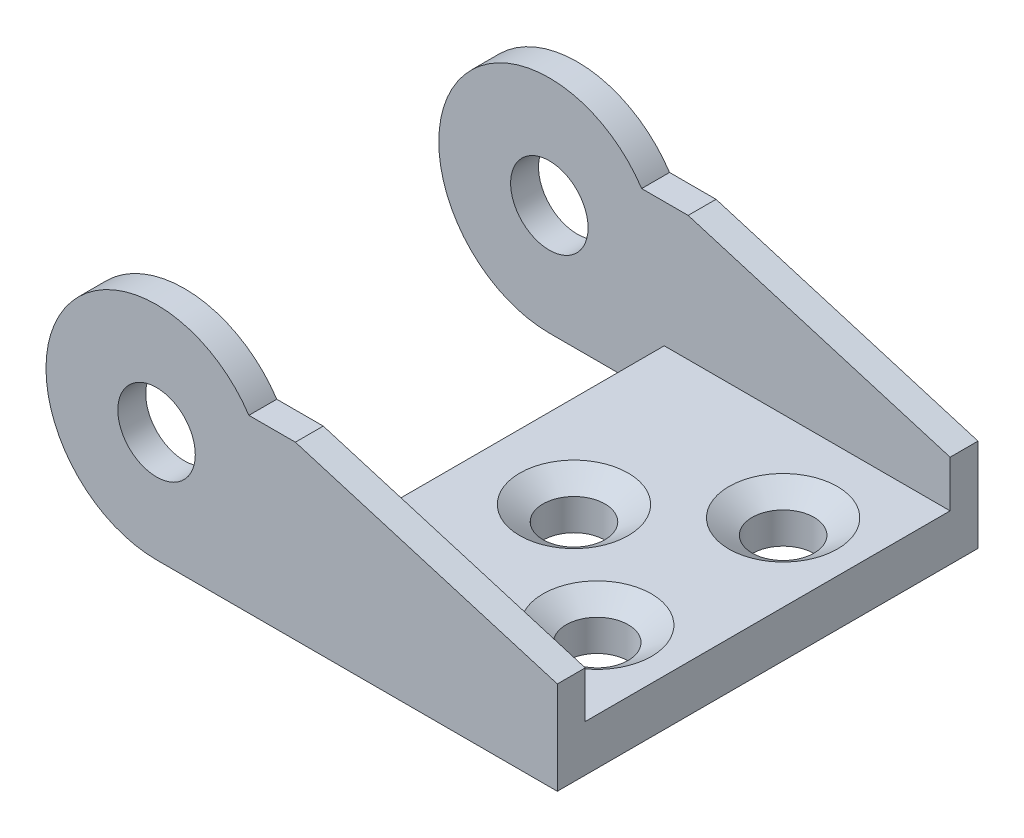
ISO-10303-21;
HEADER;
FILE_DESCRIPTION(('STEP AP214'),'2;1');
FILE_NAME('part.step','',(''),(''),'','','');
FILE_SCHEMA(('AUTOMOTIVE_DESIGN { 1 0 10303 214 1 1 1 1 }'));
ENDSEC;
DATA;
#1=APPLICATION_CONTEXT('core data for automotive mechanical design processes');
#2=APPLICATION_PROTOCOL_DEFINITION('international standard','automotive_design',2000,#1);
#3=PRODUCT_CONTEXT('',#1,'mechanical');
#4=PRODUCT('Part','Part','',(#3));
#5=PRODUCT_RELATED_PRODUCT_CATEGORY('part','',(#4));
#6=PRODUCT_DEFINITION_FORMATION('','',#4);
#7=PRODUCT_DEFINITION_CONTEXT('part definition',#1,'design');
#8=PRODUCT_DEFINITION('design','',#6,#7);
#9=PRODUCT_DEFINITION_SHAPE('','',#8);
#10=(LENGTH_UNIT() NAMED_UNIT(*) SI_UNIT(.MILLI.,.METRE.));
#11=(NAMED_UNIT(*) PLANE_ANGLE_UNIT() SI_UNIT($,.RADIAN.));
#12=(NAMED_UNIT(*) SI_UNIT($,.STERADIAN.) SOLID_ANGLE_UNIT());
#13=UNCERTAINTY_MEASURE_WITH_UNIT(LENGTH_MEASURE(1.E-05),#10,'distance_accuracy_value','');
#14=(GEOMETRIC_REPRESENTATION_CONTEXT(3) GLOBAL_UNCERTAINTY_ASSIGNED_CONTEXT((#13)) GLOBAL_UNIT_ASSIGNED_CONTEXT((#10,
#11,#12)) REPRESENTATION_CONTEXT('',''));
#15=CARTESIAN_POINT('',(0.,0.,0.));
#16=DIRECTION('',(0.,0.,1.));
#17=DIRECTION('',(1.,0.,0.));
#18=AXIS2_PLACEMENT_3D('',#15,#16,#17);
#19=CARTESIAN_POINT('',(7.135,7.135,-27.15));
#20=DIRECTION('',(0.,0.,1.));
#21=DIRECTION('',(1.,0.,0.));
#22=AXIS2_PLACEMENT_3D('',#19,#20,#21);
#23=CYLINDRICAL_SURFACE('',#22,7.135);
#24=DIRECTION('',(0.,0.,1.));
#25=VECTOR('',#24,1.);
#26=CARTESIAN_POINT('',(7.135,0.,-27.15));
#27=LINE('',#26,#25);
#28=CARTESIAN_POINT('',(7.135,0.,-27.15));
#29=VERTEX_POINT('',#28);
#30=CARTESIAN_POINT('',(7.135,0.,-25.35));
#31=VERTEX_POINT('',#30);
#32=EDGE_CURVE('E167',#29,#31,#27,.T.);
#33=ORIENTED_EDGE('',*,*,#32,.T.);
#34=CARTESIAN_POINT('',(7.135,7.135,-25.35));
#35=DIRECTION('',(0.,0.,-1.));
#36=DIRECTION('',(0.,1.,0.));
#37=AXIS2_PLACEMENT_3D('',#34,#35,#36);
#38=CIRCLE('',#37,7.135);
#39=CARTESIAN_POINT('',(13.0934058270648,11.06,-25.35));
#40=VERTEX_POINT('',#39);
#41=EDGE_CURVE('E202',#31,#40,#38,.T.);
#42=ORIENTED_EDGE('',*,*,#41,.T.);
#43=DIRECTION('',(0.,0.,1.));
#44=VECTOR('',#43,1.);
#45=CARTESIAN_POINT('',(13.0934058270648,11.06,-27.15));
#46=LINE('',#45,#44);
#47=CARTESIAN_POINT('',(13.0934058270648,11.06,-27.15));
#48=VERTEX_POINT('',#47);
#49=EDGE_CURVE('E178',#48,#40,#46,.T.);
#50=ORIENTED_EDGE('',*,*,#49,.F.);
#51=CARTESIAN_POINT('',(7.135,7.135,-27.15));
#52=DIRECTION('',(0.,0.,1.));
#53=DIRECTION('',(1.,0.,0.));
#54=AXIS2_PLACEMENT_3D('',#51,#52,#53);
#55=CIRCLE('',#54,7.135);
#56=EDGE_CURVE('E184',#48,#29,#55,.T.);
#57=ORIENTED_EDGE('',*,*,#56,.T.);
#58=EDGE_LOOP('',(#33,#42,#50,#57));
#59=FACE_BOUND('',#58,.T.);
#60=ADVANCED_FACE('F41',(#59),#23,.T.);
#61=CARTESIAN_POINT('',(33.,14.27,0.));
#62=DIRECTION('',(0.,0.,-1.));
#63=DIRECTION('',(0.,1.,0.));
#64=AXIS2_PLACEMENT_3D('',#61,#62,#63);
#65=PLANE('',#64);
#66=CARTESIAN_POINT('',(7.135,7.135,0.));
#67=DIRECTION('',(0.,0.,1.));
#68=DIRECTION('',(1.,0.,0.));
#69=AXIS2_PLACEMENT_3D('',#66,#67,#68);
#70=CIRCLE('',#69,2.5);
#71=CARTESIAN_POINT('',(9.635,7.135,0.));
#72=VERTEX_POINT('',#71);
#73=EDGE_CURVE('E189',#72,#72,#70,.T.);
#74=ORIENTED_EDGE('',*,*,#73,.F.);
#75=EDGE_LOOP('',(#74));
#76=FACE_BOUND('',#75,.T.);
#77=CARTESIAN_POINT('',(7.135,7.135,0.));
#78=DIRECTION('',(0.,0.,1.));
#79=DIRECTION('',(1.,0.,0.));
#80=AXIS2_PLACEMENT_3D('',#77,#78,#79);
#81=CIRCLE('',#80,7.135);
#82=CARTESIAN_POINT('',(13.0934058270648,11.06,0.));
#83=VERTEX_POINT('',#82);
#84=CARTESIAN_POINT('',(7.135,0.,0.));
#85=VERTEX_POINT('',#84);
#86=EDGE_CURVE('E186',#83,#85,#81,.T.);
#87=ORIENTED_EDGE('',*,*,#86,.T.);
#88=DIRECTION('',(-1.,0.,0.));
#89=VECTOR('',#88,1.);
#90=CARTESIAN_POINT('',(33.,0.,0.));
#91=LINE('',#90,#89);
#92=CARTESIAN_POINT('',(33.,0.,0.));
#93=VERTEX_POINT('',#92);
#94=EDGE_CURVE('E235',#93,#85,#91,.T.);
#95=ORIENTED_EDGE('',*,*,#94,.F.);
#96=DIRECTION('',(0.,-1.,0.));
#97=VECTOR('',#96,1.);
#98=CARTESIAN_POINT('',(33.,14.27,0.));
#99=LINE('',#98,#97);
#100=CARTESIAN_POINT('',(33.,6.,0.));
#101=VERTEX_POINT('',#100);
#102=EDGE_CURVE('E214',#101,#93,#99,.T.);
#103=ORIENTED_EDGE('',*,*,#102,.F.);
#104=DIRECTION('',(-0.95801289422509,0.286725120103676,0.));
#105=VECTOR('',#104,1.);
#106=CARTESIAN_POINT('',(16.0934058270648,11.06,0.));
#107=LINE('',#106,#105);
#108=CARTESIAN_POINT('',(16.0934058270648,11.06,0.));
#109=VERTEX_POINT('',#108);
#110=EDGE_CURVE('E65',#101,#109,#107,.T.);
#111=ORIENTED_EDGE('',*,*,#110,.T.);
#112=DIRECTION('',(-1.,0.,0.));
#113=VECTOR('',#112,1.);
#114=CARTESIAN_POINT('',(13.0934058270648,11.06,0.));
#115=LINE('',#114,#113);
#116=EDGE_CURVE('E181',#109,#83,#115,.T.);
#117=ORIENTED_EDGE('',*,*,#116,.T.);
#118=EDGE_LOOP('',(#87,#95,#103,#111,#117));
#119=FACE_BOUND('',#118,.T.);
#120=ADVANCED_FACE('F274',(#76,#119),#65,.F.);
#121=CARTESIAN_POINT('',(33.,0.,0.));
#122=DIRECTION('',(0.,1.,0.));
#123=DIRECTION('',(0.,0.,1.));
#124=AXIS2_PLACEMENT_3D('',#121,#122,#123);
#125=PLANE('',#124);
#126=CARTESIAN_POINT('',(28.,0.,-19.575));
#127=DIRECTION('',(0.,1.,0.));
#128=DIRECTION('',(0.,0.,1.));
#129=AXIS2_PLACEMENT_3D('',#126,#127,#128);
#130=CIRCLE('',#129,2.);
#131=CARTESIAN_POINT('',(28.,0.,-17.575));
#132=VERTEX_POINT('',#131);
#133=EDGE_CURVE('E158',#132,#132,#130,.T.);
#134=ORIENTED_EDGE('',*,*,#133,.T.);
#135=EDGE_LOOP('',(#134));
#136=FACE_BOUND('',#135,.T.);
#137=CARTESIAN_POINT('',(28.,0.,-7.575));
#138=DIRECTION('',(0.,1.,0.));
#139=DIRECTION('',(0.,0.,1.));
#140=AXIS2_PLACEMENT_3D('',#137,#138,#139);
#141=CIRCLE('',#140,2.);
#142=CARTESIAN_POINT('',(28.,0.,-5.575));
#143=VERTEX_POINT('',#142);
#144=EDGE_CURVE('E345',#143,#143,#141,.T.);
#145=ORIENTED_EDGE('',*,*,#144,.T.);
#146=EDGE_LOOP('',(#145));
#147=FACE_BOUND('',#146,.T.);
#148=CARTESIAN_POINT('',(20.5,0.,-13.575));
#149=DIRECTION('',(0.,1.,0.));
#150=DIRECTION('',(0.,0.,1.));
#151=AXIS2_PLACEMENT_3D('',#148,#149,#150);
#152=CIRCLE('',#151,2.);
#153=CARTESIAN_POINT('',(20.5,0.,-11.575));
#154=VERTEX_POINT('',#153);
#155=EDGE_CURVE('E161',#154,#154,#152,.T.);
#156=ORIENTED_EDGE('',*,*,#155,.T.);
#157=EDGE_LOOP('',(#156));
#158=FACE_BOUND('',#157,.T.);
#159=DIRECTION('',(1.,0.,0.));
#160=VECTOR('',#159,1.);
#161=CARTESIAN_POINT('',(14.55,0.,-1.80000000000001));
#162=LINE('',#161,#160);
#163=CARTESIAN_POINT('',(7.135,0.,-1.80000000000002));
#164=VERTEX_POINT('',#163);
#165=CARTESIAN_POINT('',(14.55,0.,-1.80000000000001));
#166=VERTEX_POINT('',#165);
#167=EDGE_CURVE('E143',#164,#166,#162,.T.);
#168=ORIENTED_EDGE('',*,*,#167,.T.);
#169=DIRECTION('',(0.,0.,-1.));
#170=VECTOR('',#169,1.);
#171=CARTESIAN_POINT('',(14.55,0.,-25.35));
#172=LINE('',#171,#170);
#173=CARTESIAN_POINT('',(14.55,0.,-25.35));
#174=VERTEX_POINT('',#173);
#175=EDGE_CURVE('E131',#166,#174,#172,.T.);
#176=ORIENTED_EDGE('',*,*,#175,.T.);
#177=DIRECTION('',(-1.,0.,0.));
#178=VECTOR('',#177,1.);
#179=CARTESIAN_POINT('',(1.32036329595735,0.,-25.35));
#180=LINE('',#179,#178);
#181=EDGE_CURVE('E142',#174,#31,#180,.T.);
#182=ORIENTED_EDGE('',*,*,#181,.T.);
#183=ORIENTED_EDGE('',*,*,#32,.F.);
#184=DIRECTION('',(-1.,0.,0.));
#185=VECTOR('',#184,1.);
#186=CARTESIAN_POINT('',(33.,0.,-27.15));
#187=LINE('',#186,#185);
#188=CARTESIAN_POINT('',(33.,0.,-27.15));
#189=VERTEX_POINT('',#188);
#190=EDGE_CURVE('E232',#189,#29,#187,.T.);
#191=ORIENTED_EDGE('',*,*,#190,.F.);
#192=DIRECTION('',(0.,0.,-1.));
#193=VECTOR('',#192,1.);
#194=CARTESIAN_POINT('',(33.,0.,0.));
#195=LINE('',#194,#193);
#196=EDGE_CURVE('E216',#93,#189,#195,.T.);
#197=ORIENTED_EDGE('',*,*,#196,.F.);
#198=ORIENTED_EDGE('',*,*,#94,.T.);
#199=EDGE_CURVE('E155',#164,#85,#27,.T.);
#200=ORIENTED_EDGE('',*,*,#199,.F.);
#201=EDGE_LOOP('',(#168,#176,#182,#183,#191,#197,#198,#200));
#202=FACE_BOUND('',#201,.T.);
#203=ADVANCED_FACE('F153',(#136,#147,#158,#202),#125,.F.);
#204=CARTESIAN_POINT('',(33.,0.,-27.15));
#205=DIRECTION('',(0.,0.,1.));
#206=DIRECTION('',(1.,0.,0.));
#207=AXIS2_PLACEMENT_3D('',#204,#205,#206);
#208=PLANE('',#207);
#209=CARTESIAN_POINT('',(7.135,7.135,-27.15));
#210=DIRECTION('',(0.,0.,1.));
#211=DIRECTION('',(1.,0.,0.));
#212=AXIS2_PLACEMENT_3D('',#209,#210,#211);
#213=CIRCLE('',#212,2.5);
#214=CARTESIAN_POINT('',(9.635,7.135,-27.15));
#215=VERTEX_POINT('',#214);
#216=EDGE_CURVE('E196',#215,#215,#213,.T.);
#217=ORIENTED_EDGE('',*,*,#216,.T.);
#218=EDGE_LOOP('',(#217));
#219=FACE_BOUND('',#218,.T.);
#220=ORIENTED_EDGE('',*,*,#56,.F.);
#221=DIRECTION('',(-1.,0.,0.));
#222=VECTOR('',#221,1.);
#223=CARTESIAN_POINT('',(13.0934058270648,11.06,-27.15));
#224=LINE('',#223,#222);
#225=CARTESIAN_POINT('',(16.0934058270648,11.06,-27.15));
#226=VERTEX_POINT('',#225);
#227=EDGE_CURVE('E170',#226,#48,#224,.T.);
#228=ORIENTED_EDGE('',*,*,#227,.F.);
#229=DIRECTION('',(-0.95801289422509,0.286725120103676,0.));
#230=VECTOR('',#229,1.);
#231=CARTESIAN_POINT('',(16.0934058270648,11.06,-27.15));
#232=LINE('',#231,#230);
#233=CARTESIAN_POINT('',(33.,6.,-27.15));
#234=VERTEX_POINT('',#233);
#235=EDGE_CURVE('E192',#234,#226,#232,.T.);
#236=ORIENTED_EDGE('',*,*,#235,.F.);
#237=DIRECTION('',(0.,1.,0.));
#238=VECTOR('',#237,1.);
#239=CARTESIAN_POINT('',(33.,0.,-27.15));
#240=LINE('',#239,#238);
#241=EDGE_CURVE('E218',#189,#234,#240,.T.);
#242=ORIENTED_EDGE('',*,*,#241,.F.);
#243=ORIENTED_EDGE('',*,*,#190,.T.);
#244=EDGE_LOOP('',(#220,#228,#236,#242,#243));
#245=FACE_BOUND('',#244,.T.);
#246=ADVANCED_FACE('F323',(#219,#245),#208,.F.);
#247=CARTESIAN_POINT('',(33.,14.27,-25.35));
#248=DIRECTION('',(0.,0.,-1.));
#249=DIRECTION('',(0.,1.,0.));
#250=AXIS2_PLACEMENT_3D('',#247,#248,#249);
#251=PLANE('',#250);
#252=CARTESIAN_POINT('',(7.135,7.135,-25.35));
#253=DIRECTION('',(0.,0.,-1.));
#254=DIRECTION('',(0.,1.,0.));
#255=AXIS2_PLACEMENT_3D('',#252,#253,#254);
#256=CIRCLE('',#255,2.5);
#257=CARTESIAN_POINT('',(9.635,7.135,-25.35));
#258=VERTEX_POINT('',#257);
#259=EDGE_CURVE('E209',#258,#258,#256,.T.);
#260=ORIENTED_EDGE('',*,*,#259,.T.);
#261=EDGE_LOOP('',(#260));
#262=FACE_BOUND('',#261,.T.);
#263=ORIENTED_EDGE('',*,*,#41,.F.);
#264=ORIENTED_EDGE('',*,*,#181,.F.);
#265=DIRECTION('',(0.,1.,0.));
#266=VECTOR('',#265,1.);
#267=CARTESIAN_POINT('',(14.55,0.,-25.35));
#268=LINE('',#267,#266);
#269=CARTESIAN_POINT('',(14.55,3.,-25.35));
#270=VERTEX_POINT('',#269);
#271=EDGE_CURVE('E137',#174,#270,#268,.T.);
#272=ORIENTED_EDGE('',*,*,#271,.T.);
#273=DIRECTION('',(-1.,0.,0.));
#274=VECTOR('',#273,1.);
#275=CARTESIAN_POINT('',(33.,3.,-25.35));
#276=LINE('',#275,#274);
#277=CARTESIAN_POINT('',(33.,3.,-25.35));
#278=VERTEX_POINT('',#277);
#279=EDGE_CURVE('E229',#278,#270,#276,.T.);
#280=ORIENTED_EDGE('',*,*,#279,.F.);
#281=DIRECTION('',(0.,-1.,0.));
#282=VECTOR('',#281,1.);
#283=CARTESIAN_POINT('',(33.,14.27,-25.35));
#284=LINE('',#283,#282);
#285=CARTESIAN_POINT('',(33.,6.,-25.35));
#286=VERTEX_POINT('',#285);
#287=EDGE_CURVE('E221',#286,#278,#284,.T.);
#288=ORIENTED_EDGE('',*,*,#287,.F.);
#289=DIRECTION('',(0.95801289422509,-0.286725120103676,0.));
#290=VECTOR('',#289,1.);
#291=CARTESIAN_POINT('',(30.728343784957,6.67988740550233,-25.35));
#292=LINE('',#291,#290);
#293=CARTESIAN_POINT('',(16.0934058270648,11.06,-25.35));
#294=VERTEX_POINT('',#293);
#295=EDGE_CURVE('E206',#294,#286,#292,.T.);
#296=ORIENTED_EDGE('',*,*,#295,.F.);
#297=DIRECTION('',(1.,0.,0.));
#298=VECTOR('',#297,1.);
#299=CARTESIAN_POINT('',(33.,11.06,-25.35));
#300=LINE('',#299,#298);
#301=EDGE_CURVE('E212',#40,#294,#300,.T.);
#302=ORIENTED_EDGE('',*,*,#301,.F.);
#303=EDGE_LOOP('',(#263,#264,#272,#280,#288,#296,#302));
#304=FACE_BOUND('',#303,.T.);
#305=ADVANCED_FACE('F320',(#262,#304),#251,.F.);
#306=CARTESIAN_POINT('',(33.,3.,-25.35));
#307=DIRECTION('',(0.,-1.,0.));
#308=DIRECTION('',(0.,0.,-1.));
#309=AXIS2_PLACEMENT_3D('',#306,#307,#308);
#310=PLANE('',#309);
#311=CARTESIAN_POINT('',(28.,3.,-7.575));
#312=DIRECTION('',(0.,-1.,0.));
#313=DIRECTION('',(0.,0.,-1.));
#314=AXIS2_PLACEMENT_3D('',#311,#312,#313);
#315=CIRCLE('',#314,3.50000000000002);
#316=CARTESIAN_POINT('',(28.,3.,-11.075));
#317=VERTEX_POINT('',#316);
#318=EDGE_CURVE('E252',#317,#317,#315,.T.);
#319=ORIENTED_EDGE('',*,*,#318,.T.);
#320=EDGE_LOOP('',(#319));
#321=FACE_BOUND('',#320,.T.);
#322=CARTESIAN_POINT('',(28.,3.,-19.575));
#323=DIRECTION('',(0.,-1.,0.));
#324=DIRECTION('',(0.,0.,-1.));
#325=AXIS2_PLACEMENT_3D('',#322,#323,#324);
#326=CIRCLE('',#325,3.50000000000002);
#327=CARTESIAN_POINT('',(28.,3.,-23.075));
#328=VERTEX_POINT('',#327);
#329=EDGE_CURVE('E249',#328,#328,#326,.T.);
#330=ORIENTED_EDGE('',*,*,#329,.T.);
#331=EDGE_LOOP('',(#330));
#332=FACE_BOUND('',#331,.T.);
#333=CARTESIAN_POINT('',(20.5,3.,-13.575));
#334=DIRECTION('',(0.,-1.,0.));
#335=DIRECTION('',(0.,0.,-1.));
#336=AXIS2_PLACEMENT_3D('',#333,#334,#335);
#337=CIRCLE('',#336,3.50000000000002);
#338=CARTESIAN_POINT('',(20.5,3.,-17.075));
#339=VERTEX_POINT('',#338);
#340=EDGE_CURVE('E246',#339,#339,#337,.T.);
#341=ORIENTED_EDGE('',*,*,#340,.T.);
#342=EDGE_LOOP('',(#341));
#343=FACE_BOUND('',#342,.T.);
#344=ORIENTED_EDGE('',*,*,#279,.T.);
#345=DIRECTION('',(0.,0.,-1.));
#346=VECTOR('',#345,1.);
#347=CARTESIAN_POINT('',(14.55,3.,-4.95000000000001));
#348=LINE('',#347,#346);
#349=CARTESIAN_POINT('',(14.55,3.,-1.80000000000001));
#350=VERTEX_POINT('',#349);
#351=EDGE_CURVE('E156',#350,#270,#348,.T.);
#352=ORIENTED_EDGE('',*,*,#351,.F.);
#353=DIRECTION('',(-1.,0.,0.));
#354=VECTOR('',#353,1.);
#355=CARTESIAN_POINT('',(33.,3.,-1.8));
#356=LINE('',#355,#354);
#357=CARTESIAN_POINT('',(33.,3.,-1.8));
#358=VERTEX_POINT('',#357);
#359=EDGE_CURVE('E151',#358,#350,#356,.T.);
#360=ORIENTED_EDGE('',*,*,#359,.F.);
#361=DIRECTION('',(0.,0.,1.));
#362=VECTOR('',#361,1.);
#363=CARTESIAN_POINT('',(33.,3.,-25.35));
#364=LINE('',#363,#362);
#365=EDGE_CURVE('E223',#278,#358,#364,.T.);
#366=ORIENTED_EDGE('',*,*,#365,.F.);
#367=EDGE_LOOP('',(#344,#352,#360,#366));
#368=FACE_BOUND('',#367,.T.);
#369=ADVANCED_FACE('F316',(#321,#332,#343,#368),#310,.F.);
#370=CARTESIAN_POINT('',(33.,3.,-1.8));
#371=DIRECTION('',(0.,0.,1.));
#372=DIRECTION('',(0.,-1.,0.));
#373=AXIS2_PLACEMENT_3D('',#370,#371,#372);
#374=PLANE('',#373);
#375=CARTESIAN_POINT('',(7.135,7.135,-1.8));
#376=DIRECTION('',(0.,0.,1.));
#377=DIRECTION('',(0.,-1.,0.));
#378=AXIS2_PLACEMENT_3D('',#375,#376,#377);
#379=CIRCLE('',#378,2.5);
#380=CARTESIAN_POINT('',(9.635,7.135,-1.8));
#381=VERTEX_POINT('',#380);
#382=EDGE_CURVE('E208',#381,#381,#379,.T.);
#383=ORIENTED_EDGE('',*,*,#382,.T.);
#384=EDGE_LOOP('',(#383));
#385=FACE_BOUND('',#384,.T.);
#386=ORIENTED_EDGE('',*,*,#359,.T.);
#387=DIRECTION('',(0.,1.,0.));
#388=VECTOR('',#387,1.);
#389=CARTESIAN_POINT('',(14.55,0.,-1.80000000000001));
#390=LINE('',#389,#388);
#391=EDGE_CURVE('E134',#166,#350,#390,.T.);
#392=ORIENTED_EDGE('',*,*,#391,.F.);
#393=ORIENTED_EDGE('',*,*,#167,.F.);
#394=CARTESIAN_POINT('',(7.135,7.135,-1.8));
#395=DIRECTION('',(0.,0.,1.));
#396=DIRECTION('',(0.,-1.,0.));
#397=AXIS2_PLACEMENT_3D('',#394,#395,#396);
#398=CIRCLE('',#397,7.135);
#399=CARTESIAN_POINT('',(13.0934058270648,11.06,-1.80000000000001));
#400=VERTEX_POINT('',#399);
#401=EDGE_CURVE('E57',#400,#164,#398,.T.);
#402=ORIENTED_EDGE('',*,*,#401,.F.);
#403=DIRECTION('',(-1.,0.,0.));
#404=VECTOR('',#403,1.);
#405=CARTESIAN_POINT('',(33.,11.06,-1.8));
#406=LINE('',#405,#404);
#407=CARTESIAN_POINT('',(16.0934058270648,11.06,-1.80000000000001));
#408=VERTEX_POINT('',#407);
#409=EDGE_CURVE('E239',#408,#400,#406,.T.);
#410=ORIENTED_EDGE('',*,*,#409,.F.);
#411=DIRECTION('',(-0.95801289422509,0.286725120103676,0.));
#412=VECTOR('',#411,1.);
#413=CARTESIAN_POINT('',(33.8240590864727,5.7533661165046,-1.8));
#414=LINE('',#413,#412);
#415=CARTESIAN_POINT('',(33.,6.,-1.80000000000001));
#416=VERTEX_POINT('',#415);
#417=EDGE_CURVE('E204',#416,#408,#414,.T.);
#418=ORIENTED_EDGE('',*,*,#417,.F.);
#419=DIRECTION('',(0.,1.,0.));
#420=VECTOR('',#419,1.);
#421=CARTESIAN_POINT('',(33.,3.,-1.8));
#422=LINE('',#421,#420);
#423=EDGE_CURVE('E225',#358,#416,#422,.T.);
#424=ORIENTED_EDGE('',*,*,#423,.F.);
#425=EDGE_LOOP('',(#386,#392,#393,#402,#410,#418,#424));
#426=FACE_BOUND('',#425,.T.);
#427=ADVANCED_FACE('F147',(#385,#426),#374,.F.);
#428=CARTESIAN_POINT('',(33.,0.,0.));
#429=DIRECTION('',(1.,0.,0.));
#430=DIRECTION('',(0.,0.,-1.));
#431=AXIS2_PLACEMENT_3D('',#428,#429,#430);
#432=PLANE('',#431);
#433=ORIENTED_EDGE('',*,*,#241,.T.);
#434=DIRECTION('',(0.,0.,1.));
#435=VECTOR('',#434,1.);
#436=CARTESIAN_POINT('',(33.,6.,-27.15));
#437=LINE('',#436,#435);
#438=EDGE_CURVE('E171',#234,#286,#437,.T.);
#439=ORIENTED_EDGE('',*,*,#438,.T.);
#440=ORIENTED_EDGE('',*,*,#287,.T.);
#441=ORIENTED_EDGE('',*,*,#365,.T.);
#442=ORIENTED_EDGE('',*,*,#423,.T.);
#443=DIRECTION('',(0.,0.,1.));
#444=VECTOR('',#443,1.);
#445=CARTESIAN_POINT('',(33.,6.,0.));
#446=LINE('',#445,#444);
#447=EDGE_CURVE('E237',#416,#101,#446,.T.);
#448=ORIENTED_EDGE('',*,*,#447,.T.);
#449=ORIENTED_EDGE('',*,*,#102,.T.);
#450=ORIENTED_EDGE('',*,*,#196,.T.);
#451=EDGE_LOOP('',(#433,#439,#440,#441,#442,#448,#449,#450));
#452=FACE_BOUND('',#451,.T.);
#453=ADVANCED_FACE('F308',(#452),#432,.T.);
#454=CARTESIAN_POINT('',(13.0934058270648,11.06,-27.15));
#455=DIRECTION('',(0.,1.,0.));
#456=DIRECTION('',(0.,0.,1.));
#457=AXIS2_PLACEMENT_3D('',#454,#455,#456);
#458=PLANE('',#457);
#459=ORIENTED_EDGE('',*,*,#301,.T.);
#460=DIRECTION('',(0.,0.,1.));
#461=VECTOR('',#460,1.);
#462=CARTESIAN_POINT('',(16.0934058270648,11.06,-27.15));
#463=LINE('',#462,#461);
#464=EDGE_CURVE('E174',#226,#294,#463,.T.);
#465=ORIENTED_EDGE('',*,*,#464,.F.);
#466=ORIENTED_EDGE('',*,*,#227,.T.);
#467=ORIENTED_EDGE('',*,*,#49,.T.);
#468=EDGE_LOOP('',(#459,#465,#466,#467));
#469=FACE_BOUND('',#468,.T.);
#470=ADVANCED_FACE('F306',(#469),#458,.T.);
#471=ORIENTED_EDGE('',*,*,#409,.T.);
#472=EDGE_CURVE('E165',#400,#83,#46,.T.);
#473=ORIENTED_EDGE('',*,*,#472,.T.);
#474=ORIENTED_EDGE('',*,*,#116,.F.);
#475=EDGE_CURVE('E177',#408,#109,#463,.T.);
#476=ORIENTED_EDGE('',*,*,#475,.F.);
#477=EDGE_LOOP('',(#471,#473,#474,#476));
#478=FACE_BOUND('',#477,.T.);
#479=ADVANCED_FACE('F303',(#478),#458,.T.);
#480=CARTESIAN_POINT('',(16.0934058270648,11.06,-27.15));
#481=DIRECTION('',(0.286725120103676,0.958012894225089,0.));
#482=DIRECTION('',(-0.95801289422509,0.286725120103676,0.));
#483=AXIS2_PLACEMENT_3D('',#480,#481,#482);
#484=PLANE('',#483);
#485=ORIENTED_EDGE('',*,*,#295,.T.);
#486=ORIENTED_EDGE('',*,*,#438,.F.);
#487=ORIENTED_EDGE('',*,*,#235,.T.);
#488=ORIENTED_EDGE('',*,*,#464,.T.);
#489=EDGE_LOOP('',(#485,#486,#487,#488));
#490=FACE_BOUND('',#489,.T.);
#491=ADVANCED_FACE('F299',(#490),#484,.T.);
#492=ORIENTED_EDGE('',*,*,#417,.T.);
#493=ORIENTED_EDGE('',*,*,#475,.T.);
#494=ORIENTED_EDGE('',*,*,#110,.F.);
#495=ORIENTED_EDGE('',*,*,#447,.F.);
#496=EDGE_LOOP('',(#492,#493,#494,#495));
#497=FACE_BOUND('',#496,.T.);
#498=ADVANCED_FACE('F289',(#497),#484,.T.);
#499=ORIENTED_EDGE('',*,*,#401,.T.);
#500=ORIENTED_EDGE('',*,*,#199,.T.);
#501=ORIENTED_EDGE('',*,*,#86,.F.);
#502=ORIENTED_EDGE('',*,*,#472,.F.);
#503=EDGE_LOOP('',(#499,#500,#501,#502));
#504=FACE_BOUND('',#503,.T.);
#505=ADVANCED_FACE('F277',(#504),#23,.T.);
#506=CARTESIAN_POINT('',(7.135,7.135,-27.15));
#507=DIRECTION('',(0.,0.,1.));
#508=DIRECTION('',(1.,0.,0.));
#509=AXIS2_PLACEMENT_3D('',#506,#507,#508);
#510=CYLINDRICAL_SURFACE('',#509,2.5);
#511=CARTESIAN_POINT('',(9.635,7.135,0.));
#512=CARTESIAN_POINT('',(9.635,7.135,-0.0187500000000002));
#513=CARTESIAN_POINT('',(9.635,7.135,-0.0375000000000005));
#514=CARTESIAN_POINT('',(9.635,7.135,-0.075000000000001));
#515=CARTESIAN_POINT('',(9.635,7.135,-0.0937500000000012));
#516=CARTESIAN_POINT('',(9.635,7.135,-0.131250000000001));
#517=CARTESIAN_POINT('',(9.635,7.135,-0.15));
#518=CARTESIAN_POINT('',(9.635,7.135,-0.187499999999999));
#519=CARTESIAN_POINT('',(9.635,7.135,-0.206249999999999));
#520=CARTESIAN_POINT('',(9.635,7.135,-0.24375));
#521=CARTESIAN_POINT('',(9.635,7.135,-0.2625));
#522=CARTESIAN_POINT('',(9.635,7.135,-0.3));
#523=CARTESIAN_POINT('',(9.635,7.135,-0.318750000000001));
#524=CARTESIAN_POINT('',(9.635,7.135,-0.356250000000001));
#525=CARTESIAN_POINT('',(9.635,7.135,-0.375000000000001));
#526=CARTESIAN_POINT('',(9.635,7.135,-0.412500000000001));
#527=CARTESIAN_POINT('',(9.635,7.135,-0.43125));
#528=CARTESIAN_POINT('',(9.635,7.135,-0.468749999999999));
#529=CARTESIAN_POINT('',(9.635,7.135,-0.487499999999999));
#530=CARTESIAN_POINT('',(9.635,7.135,-0.525));
#531=CARTESIAN_POINT('',(9.635,7.135,-0.54375));
#532=CARTESIAN_POINT('',(9.635,7.135,-0.581250000000001));
#533=CARTESIAN_POINT('',(9.635,7.135,-0.600000000000001));
#534=CARTESIAN_POINT('',(9.635,7.135,-0.637500000000002));
#535=CARTESIAN_POINT('',(9.635,7.135,-0.656250000000002));
#536=CARTESIAN_POINT('',(9.635,7.135,-0.693750000000002));
#537=CARTESIAN_POINT('',(9.635,7.135,-0.712500000000002));
#538=CARTESIAN_POINT('',(9.635,7.135,-0.750000000000002));
#539=CARTESIAN_POINT('',(9.635,7.135,-0.768750000000001));
#540=CARTESIAN_POINT('',(9.635,7.135,-0.80625));
#541=CARTESIAN_POINT('',(9.635,7.135,-0.825000000000001));
#542=CARTESIAN_POINT('',(9.635,7.135,-0.862500000000001));
#543=CARTESIAN_POINT('',(9.635,7.135,-0.881250000000001));
#544=CARTESIAN_POINT('',(9.635,7.135,-0.918750000000002));
#545=CARTESIAN_POINT('',(9.635,7.135,-0.937500000000002));
#546=CARTESIAN_POINT('',(9.635,7.135,-0.975000000000002));
#547=CARTESIAN_POINT('',(9.635,7.135,-0.993750000000003));
#548=CARTESIAN_POINT('',(9.635,7.135,-1.03125));
#549=CARTESIAN_POINT('',(9.635,7.135,-1.05));
#550=CARTESIAN_POINT('',(9.635,7.135,-1.0875));
#551=CARTESIAN_POINT('',(9.635,7.135,-1.10625));
#552=CARTESIAN_POINT('',(9.635,7.135,-1.14375));
#553=CARTESIAN_POINT('',(9.635,7.135,-1.1625));
#554=CARTESIAN_POINT('',(9.635,7.135,-1.2));
#555=CARTESIAN_POINT('',(9.635,7.135,-1.21875));
#556=CARTESIAN_POINT('',(9.635,7.135,-1.25625));
#557=CARTESIAN_POINT('',(9.635,7.135,-1.275));
#558=CARTESIAN_POINT('',(9.635,7.135,-1.3125));
#559=CARTESIAN_POINT('',(9.635,7.135,-1.33125));
#560=CARTESIAN_POINT('',(9.635,7.135,-1.36875));
#561=CARTESIAN_POINT('',(9.635,7.135,-1.3875));
#562=CARTESIAN_POINT('',(9.635,7.135,-1.425));
#563=CARTESIAN_POINT('',(9.635,7.135,-1.44375));
#564=CARTESIAN_POINT('',(9.635,7.135,-1.48125));
#565=CARTESIAN_POINT('',(9.635,7.135,-1.5));
#566=CARTESIAN_POINT('',(9.635,7.135,-1.5375));
#567=CARTESIAN_POINT('',(9.635,7.135,-1.55625));
#568=CARTESIAN_POINT('',(9.635,7.135,-1.59375));
#569=CARTESIAN_POINT('',(9.635,7.135,-1.6125));
#570=CARTESIAN_POINT('',(9.635,7.135,-1.65));
#571=CARTESIAN_POINT('',(9.635,7.135,-1.66875));
#572=CARTESIAN_POINT('',(9.635,7.135,-1.70625));
#573=CARTESIAN_POINT('',(9.635,7.135,-1.725));
#574=CARTESIAN_POINT('',(9.635,7.135,-1.7625));
#575=CARTESIAN_POINT('',(9.635,7.135,-1.78125));
#576=CARTESIAN_POINT('',(9.635,7.135,-1.8));
#577=B_SPLINE_CURVE_WITH_KNOTS('',3,(#511,#512,#513,#514,#515,#516,#517,#518,#519,#520,#521,
#522,#523,#524,#525,#526,#527,#528,#529,#530,#531,#532,#533,#534,#535,#536,#537,#538,#539,#540,
#541,#542,#543,#544,#545,#546,#547,#548,#549,#550,#551,#552,#553,#554,#555,#556,#557,#558,#559,
#560,#561,#562,#563,#564,#565,#566,#567,#568,#569,#570,#571,#572,#573,#574,#575,#576),
.UNSPECIFIED.,.F.,.F.,(4,2,2,2,2,2,2,2,2,2,2,2,2,2,2,2,2,2,2,2,2,2,2,2,2,2,2,2,2,2,2,2,4),(0.,
0.0562500000000007,0.112500000000001,0.168749999999999,0.225,0.28125,0.337500000000001,
0.393750000000002,0.449999999999999,0.50625,0.5625,0.618750000000001,0.675000000000002,
0.731250000000003,0.7875,0.843750000000001,0.900000000000001,0.956250000000002,1.0125,1.06875,
1.125,1.18125,1.2375,1.29375,1.35,1.40625,1.4625,1.51875,1.575,1.63125,1.6875,1.74375,1.8),.UNSPECIFIED.);
#578=EDGE_CURVE('BSEAM288',#72,#381,#577,.T.);
#579=ORIENTED_EDGE('',*,*,#73,.T.);
#580=ORIENTED_EDGE('',*,*,#382,.F.);
#581=ORIENTED_EDGE('',*,*,#578,.T.);
#582=ORIENTED_EDGE('',*,*,#578,.F.);
#583=EDGE_LOOP('',(#579,#581,#580,#582));
#584=FACE_BOUND('',#583,.T.);
#585=ADVANCED_FACE('F288',(#584),#510,.F.);
#586=CARTESIAN_POINT('',(9.635,7.135,-27.15));
#587=CARTESIAN_POINT('',(9.635,7.135,-27.13125));
#588=CARTESIAN_POINT('',(9.635,7.135,-27.1125));
#589=CARTESIAN_POINT('',(9.635,7.135,-27.075));
#590=CARTESIAN_POINT('',(9.635,7.135,-27.05625));
#591=CARTESIAN_POINT('',(9.635,7.135,-27.01875));
#592=CARTESIAN_POINT('',(9.635,7.135,-27.));
#593=CARTESIAN_POINT('',(9.635,7.135,-26.9625));
#594=CARTESIAN_POINT('',(9.635,7.135,-26.94375));
#595=CARTESIAN_POINT('',(9.635,7.135,-26.90625));
#596=CARTESIAN_POINT('',(9.635,7.135,-26.8875));
#597=CARTESIAN_POINT('',(9.635,7.135,-26.85));
#598=CARTESIAN_POINT('',(9.635,7.135,-26.83125));
#599=CARTESIAN_POINT('',(9.635,7.135,-26.79375));
#600=CARTESIAN_POINT('',(9.635,7.135,-26.775));
#601=CARTESIAN_POINT('',(9.635,7.135,-26.7375));
#602=CARTESIAN_POINT('',(9.635,7.135,-26.71875));
#603=CARTESIAN_POINT('',(9.635,7.135,-26.68125));
#604=CARTESIAN_POINT('',(9.635,7.135,-26.6625));
#605=CARTESIAN_POINT('',(9.635,7.135,-26.625));
#606=CARTESIAN_POINT('',(9.635,7.135,-26.60625));
#607=CARTESIAN_POINT('',(9.635,7.135,-26.56875));
#608=CARTESIAN_POINT('',(9.635,7.135,-26.55));
#609=CARTESIAN_POINT('',(9.635,7.135,-26.5125));
#610=CARTESIAN_POINT('',(9.635,7.135,-26.49375));
#611=CARTESIAN_POINT('',(9.635,7.135,-26.45625));
#612=CARTESIAN_POINT('',(9.635,7.135,-26.4375));
#613=CARTESIAN_POINT('',(9.635,7.135,-26.4));
#614=CARTESIAN_POINT('',(9.635,7.135,-26.38125));
#615=CARTESIAN_POINT('',(9.635,7.135,-26.34375));
#616=CARTESIAN_POINT('',(9.635,7.135,-26.325));
#617=CARTESIAN_POINT('',(9.635,7.135,-26.2875));
#618=CARTESIAN_POINT('',(9.635,7.135,-26.26875));
#619=CARTESIAN_POINT('',(9.635,7.135,-26.23125));
#620=CARTESIAN_POINT('',(9.635,7.135,-26.2125));
#621=CARTESIAN_POINT('',(9.635,7.135,-26.175));
#622=CARTESIAN_POINT('',(9.635,7.135,-26.15625));
#623=CARTESIAN_POINT('',(9.635,7.135,-26.11875));
#624=CARTESIAN_POINT('',(9.635,7.135,-26.1));
#625=CARTESIAN_POINT('',(9.635,7.135,-26.0625));
#626=CARTESIAN_POINT('',(9.635,7.135,-26.04375));
#627=CARTESIAN_POINT('',(9.635,7.135,-26.00625));
#628=CARTESIAN_POINT('',(9.635,7.135,-25.9875));
#629=CARTESIAN_POINT('',(9.635,7.135,-25.95));
#630=CARTESIAN_POINT('',(9.635,7.135,-25.93125));
#631=CARTESIAN_POINT('',(9.635,7.135,-25.89375));
#632=CARTESIAN_POINT('',(9.635,7.135,-25.875));
#633=CARTESIAN_POINT('',(9.635,7.135,-25.8375));
#634=CARTESIAN_POINT('',(9.635,7.135,-25.81875));
#635=CARTESIAN_POINT('',(9.635,7.135,-25.78125));
#636=CARTESIAN_POINT('',(9.635,7.135,-25.7625));
#637=CARTESIAN_POINT('',(9.635,7.135,-25.725));
#638=CARTESIAN_POINT('',(9.635,7.135,-25.70625));
#639=CARTESIAN_POINT('',(9.635,7.135,-25.66875));
#640=CARTESIAN_POINT('',(9.635,7.135,-25.65));
#641=CARTESIAN_POINT('',(9.635,7.135,-25.6125));
#642=CARTESIAN_POINT('',(9.635,7.135,-25.59375));
#643=CARTESIAN_POINT('',(9.635,7.135,-25.55625));
#644=CARTESIAN_POINT('',(9.635,7.135,-25.5375));
#645=CARTESIAN_POINT('',(9.635,7.135,-25.5));
#646=CARTESIAN_POINT('',(9.635,7.135,-25.48125));
#647=CARTESIAN_POINT('',(9.635,7.135,-25.44375));
#648=CARTESIAN_POINT('',(9.635,7.135,-25.425));
#649=CARTESIAN_POINT('',(9.635,7.135,-25.3875));
#650=CARTESIAN_POINT('',(9.635,7.135,-25.36875));
#651=CARTESIAN_POINT('',(9.635,7.135,-25.35));
#652=B_SPLINE_CURVE_WITH_KNOTS('',3,(#586,#587,#588,#589,#590,#591,#592,#593,#594,#595,#596,
#597,#598,#599,#600,#601,#602,#603,#604,#605,#606,#607,#608,#609,#610,#611,#612,#613,#614,#615,
#616,#617,#618,#619,#620,#621,#622,#623,#624,#625,#626,#627,#628,#629,#630,#631,#632,#633,#634,
#635,#636,#637,#638,#639,#640,#641,#642,#643,#644,#645,#646,#647,#648,#649,#650,#651),
.UNSPECIFIED.,.F.,.F.,(4,2,2,2,2,2,2,2,2,2,2,2,2,2,2,2,2,2,2,2,2,2,2,2,2,2,2,2,2,2,2,2,4),(0.,
0.0562500000000007,0.112500000000001,0.168750000000002,0.225000000000003,0.28125,
0.337500000000001,0.393750000000002,0.450000000000003,0.50625,0.5625,0.618750000000001,
0.675000000000002,0.731250000000003,0.7875,0.843750000000001,0.900000000000001,
0.956250000000002,1.0125,1.06875,1.125,1.18125,1.2375,1.29375,1.35,1.40625,1.4625,1.51875,1.575,
1.63125,1.6875,1.74375,1.8),.UNSPECIFIED.);
#653=EDGE_CURVE('BSEAM295',#215,#258,#652,.T.);
#654=ORIENTED_EDGE('',*,*,#216,.F.);
#655=ORIENTED_EDGE('',*,*,#259,.F.);
#656=ORIENTED_EDGE('',*,*,#653,.T.);
#657=ORIENTED_EDGE('',*,*,#653,.F.);
#658=EDGE_LOOP('',(#654,#656,#655,#657));
#659=FACE_BOUND('',#658,.T.);
#660=ADVANCED_FACE('F295',(#659),#510,.F.);
#661=CARTESIAN_POINT('',(14.55,0.,-25.35));
#662=DIRECTION('',(1.,0.,0.));
#663=DIRECTION('',(0.,0.,-1.));
#664=AXIS2_PLACEMENT_3D('',#661,#662,#663);
#665=PLANE('',#664);
#666=ORIENTED_EDGE('',*,*,#351,.T.);
#667=ORIENTED_EDGE('',*,*,#271,.F.);
#668=ORIENTED_EDGE('',*,*,#175,.F.);
#669=ORIENTED_EDGE('',*,*,#391,.T.);
#670=EDGE_LOOP('',(#666,#667,#668,#669));
#671=FACE_BOUND('',#670,.T.);
#672=ADVANCED_FACE('F133',(#671),#665,.F.);
#673=CARTESIAN_POINT('',(20.5,0.,-13.575));
#674=DIRECTION('',(0.,1.,0.));
#675=DIRECTION('',(0.,0.,1.));
#676=AXIS2_PLACEMENT_3D('',#673,#674,#675);
#677=CYLINDRICAL_SURFACE('',#676,2.);
#678=CARTESIAN_POINT('',(20.5,2.02588861020373,-13.575));
#679=DIRECTION('',(0.,-1.,0.));
#680=DIRECTION('',(0.,0.,-1.));
#681=AXIS2_PLACEMENT_3D('',#678,#679,#680);
#682=CIRCLE('',#681,2.);
#683=CARTESIAN_POINT('',(20.5,2.02588861020373,-11.575));
#684=VERTEX_POINT('',#683);
#685=EDGE_CURVE('E12',#684,#684,#682,.F.);
#686=CARTESIAN_POINT('',(20.5,2.02588861020373,-11.575));
#687=CARTESIAN_POINT('',(20.5,2.00478560384745,-11.575));
#688=CARTESIAN_POINT('',(20.5,1.98368259749116,-11.575));
#689=CARTESIAN_POINT('',(20.5,1.94147658477858,-11.575));
#690=CARTESIAN_POINT('',(20.5,1.92037357842229,-11.575));
#691=CARTESIAN_POINT('',(20.5,1.87816756570971,-11.575));
#692=CARTESIAN_POINT('',(20.5,1.85706455935342,-11.575));
#693=CARTESIAN_POINT('',(20.5,1.81485854664084,-11.575));
#694=CARTESIAN_POINT('',(20.5,1.79375554028456,-11.575));
#695=CARTESIAN_POINT('',(20.5,1.75154952757198,-11.575));
#696=CARTESIAN_POINT('',(20.5,1.73044652121569,-11.575));
#697=CARTESIAN_POINT('',(20.5,1.68824050850311,-11.575));
#698=CARTESIAN_POINT('',(20.5,1.66713750214682,-11.575));
#699=CARTESIAN_POINT('',(20.5,1.62493148943424,-11.575));
#700=CARTESIAN_POINT('',(20.5,1.60382848307796,-11.575));
#701=CARTESIAN_POINT('',(20.5,1.56162247036538,-11.575));
#702=CARTESIAN_POINT('',(20.5,1.54051946400909,-11.575));
#703=CARTESIAN_POINT('',(20.5,1.49831345129651,-11.575));
#704=CARTESIAN_POINT('',(20.5,1.47721044494022,-11.575));
#705=CARTESIAN_POINT('',(20.5,1.43500443222764,-11.575));
#706=CARTESIAN_POINT('',(20.5,1.41390142587135,-11.575));
#707=CARTESIAN_POINT('',(20.5,1.37169541315878,-11.575));
#708=CARTESIAN_POINT('',(20.5,1.35059240680249,-11.575));
#709=CARTESIAN_POINT('',(20.5,1.30838639408991,-11.575));
#710=CARTESIAN_POINT('',(20.5,1.28728338773362,-11.575));
#711=CARTESIAN_POINT('',(20.5,1.24507737502104,-11.575));
#712=CARTESIAN_POINT('',(20.5,1.22397436866475,-11.575));
#713=CARTESIAN_POINT('',(20.5,1.18176835595218,-11.575));
#714=CARTESIAN_POINT('',(20.5,1.16066534959589,-11.575));
#715=CARTESIAN_POINT('',(20.5,1.11845933688331,-11.575));
#716=CARTESIAN_POINT('',(20.5,1.09735633052702,-11.575));
#717=CARTESIAN_POINT('',(20.5,1.05515031781444,-11.575));
#718=CARTESIAN_POINT('',(20.5,1.03404731145815,-11.575));
#719=CARTESIAN_POINT('',(20.5,0.991841298745575,-11.575));
#720=CARTESIAN_POINT('',(20.5,0.970738292389286,-11.575));
#721=CARTESIAN_POINT('',(20.5,0.928532279676708,-11.575));
#722=CARTESIAN_POINT('',(20.5,0.907429273320419,-11.575));
#723=CARTESIAN_POINT('',(20.5,0.865223260607841,-11.575));
#724=CARTESIAN_POINT('',(20.5,0.844120254251552,-11.575));
#725=CARTESIAN_POINT('',(20.5,0.801914241538974,-11.575));
#726=CARTESIAN_POINT('',(20.5,0.780811235182685,-11.575));
#727=CARTESIAN_POINT('',(20.5,0.738605222470107,-11.575));
#728=CARTESIAN_POINT('',(20.5,0.717502216113818,-11.575));
#729=CARTESIAN_POINT('',(20.5,0.67529620340124,-11.575));
#730=CARTESIAN_POINT('',(20.5,0.654193197044951,-11.575));
#731=CARTESIAN_POINT('',(20.5,0.611987184332373,-11.575));
#732=CARTESIAN_POINT('',(20.5,0.590884177976084,-11.575));
#733=CARTESIAN_POINT('',(20.5,0.548678165263506,-11.575));
#734=CARTESIAN_POINT('',(20.5,0.527575158907217,-11.575));
#735=CARTESIAN_POINT('',(20.5,0.48536914619464,-11.575));
#736=CARTESIAN_POINT('',(20.5,0.464266139838351,-11.575));
#737=CARTESIAN_POINT('',(20.5,0.422060127125773,-11.575));
#738=CARTESIAN_POINT('',(20.5,0.400957120769484,-11.575));
#739=CARTESIAN_POINT('',(20.5,0.358751108056906,-11.575));
#740=CARTESIAN_POINT('',(20.5,0.337648101700617,-11.575));
#741=CARTESIAN_POINT('',(20.5,0.295442088988039,-11.575));
#742=CARTESIAN_POINT('',(20.5,0.27433908263175,-11.575));
#743=CARTESIAN_POINT('',(20.5,0.232133069919172,-11.575));
#744=CARTESIAN_POINT('',(20.5,0.211030063562883,-11.575));
#745=CARTESIAN_POINT('',(20.5,0.168824050850305,-11.575));
#746=CARTESIAN_POINT('',(20.5,0.147721044494016,-11.575));
#747=CARTESIAN_POINT('',(20.5,0.105515031781438,-11.575));
#748=CARTESIAN_POINT('',(20.5,0.084412025425149,-11.575));
#749=CARTESIAN_POINT('',(20.5,0.0422060127125711,-11.575));
#750=CARTESIAN_POINT('',(20.5,0.0211030063562822,-11.575));
#751=CARTESIAN_POINT('',(20.5,0.,-11.575));
#752=B_SPLINE_CURVE_WITH_KNOTS('',3,(#686,#687,#688,#689,#690,#691,#692,#693,#694,#695,#696,
#697,#698,#699,#700,#701,#702,#703,#704,#705,#706,#707,#708,#709,#710,#711,#712,#713,#714,#715,
#716,#717,#718,#719,#720,#721,#722,#723,#724,#725,#726,#727,#728,#729,#730,#731,#732,#733,#734,
#735,#736,#737,#738,#739,#740,#741,#742,#743,#744,#745,#746,#747,#748,#749,#750,#751),
.UNSPECIFIED.,.F.,.F.,(4,2,2,2,2,2,2,2,2,2,2,2,2,2,2,2,2,2,2,2,2,2,2,2,2,2,2,2,2,2,2,2,4),(0.,
0.0633090190688668,0.126618038137733,0.1899270572066,0.253236076275467,0.316545095344334,
0.379854114413201,0.443163133482068,0.506472152550935,0.569781171619802,0.633090190688669,
0.696399209757536,0.759708228826403,0.82301724789527,0.886326266964137,0.949635286033004,
1.01294430510187,1.07625332417074,1.1395623432396,1.20287136230847,1.26618038137734,
1.32948940044621,1.39279841951507,1.45610743858394,1.51941645765281,1.58272547672167,
1.64603449579054,1.70934351485941,1.77265253392827,1.83596155299714,1.89927057206601,
1.96257959113487,2.02588861020374),.UNSPECIFIED.);
#753=EDGE_CURVE('BSEAM350',#684,#154,#752,.T.);
#754=ORIENTED_EDGE('',*,*,#685,.T.);
#755=ORIENTED_EDGE('',*,*,#155,.F.);
#756=ORIENTED_EDGE('',*,*,#753,.T.);
#757=ORIENTED_EDGE('',*,*,#753,.F.);
#758=EDGE_LOOP('',(#754,#756,#755,#757));
#759=FACE_BOUND('',#758,.T.);
#760=ADVANCED_FACE('F350',(#759),#677,.F.);
#761=CARTESIAN_POINT('',(28.,0.,-7.575));
#762=DIRECTION('',(0.,1.,0.));
#763=DIRECTION('',(0.,0.,1.));
#764=AXIS2_PLACEMENT_3D('',#761,#762,#763);
#765=CYLINDRICAL_SURFACE('',#764,2.);
#766=CARTESIAN_POINT('',(28.,2.02588861020373,-7.575));
#767=DIRECTION('',(0.,-1.,0.));
#768=DIRECTION('',(0.,0.,-1.));
#769=AXIS2_PLACEMENT_3D('',#766,#767,#768);
#770=CIRCLE('',#769,2.);
#771=CARTESIAN_POINT('',(28.,2.02588861020373,-5.575));
#772=VERTEX_POINT('',#771);
#773=EDGE_CURVE('E243',#772,#772,#770,.F.);
#774=CARTESIAN_POINT('',(28.,2.02588861020373,-5.575));
#775=CARTESIAN_POINT('',(28.,2.00478560384744,-5.575));
#776=CARTESIAN_POINT('',(28.,1.98368259749115,-5.575));
#777=CARTESIAN_POINT('',(28.,1.94147658477857,-5.575));
#778=CARTESIAN_POINT('',(28.,1.92037357842228,-5.575));
#779=CARTESIAN_POINT('',(28.,1.87816756570971,-5.575));
#780=CARTESIAN_POINT('',(28.,1.85706455935342,-5.575));
#781=CARTESIAN_POINT('',(28.,1.81485854664084,-5.575));
#782=CARTESIAN_POINT('',(28.,1.79375554028455,-5.575));
#783=CARTESIAN_POINT('',(28.,1.75154952757197,-5.575));
#784=CARTESIAN_POINT('',(28.,1.73044652121568,-5.575));
#785=CARTESIAN_POINT('',(28.,1.68824050850311,-5.575));
#786=CARTESIAN_POINT('',(28.,1.66713750214682,-5.575));
#787=CARTESIAN_POINT('',(28.,1.62493148943424,-5.575));
#788=CARTESIAN_POINT('',(28.,1.60382848307795,-5.575));
#789=CARTESIAN_POINT('',(28.,1.56162247036537,-5.575));
#790=CARTESIAN_POINT('',(28.,1.54051946400908,-5.575));
#791=CARTESIAN_POINT('',(28.,1.49831345129651,-5.575));
#792=CARTESIAN_POINT('',(28.,1.47721044494022,-5.575));
#793=CARTESIAN_POINT('',(28.,1.43500443222764,-5.575));
#794=CARTESIAN_POINT('',(28.,1.41390142587135,-5.575));
#795=CARTESIAN_POINT('',(28.,1.37169541315877,-5.575));
#796=CARTESIAN_POINT('',(28.,1.35059240680248,-5.575));
#797=CARTESIAN_POINT('',(28.,1.30838639408991,-5.575));
#798=CARTESIAN_POINT('',(28.,1.28728338773362,-5.575));
#799=CARTESIAN_POINT('',(28.,1.24507737502104,-5.575));
#800=CARTESIAN_POINT('',(28.,1.22397436866475,-5.575));
#801=CARTESIAN_POINT('',(28.,1.18176835595217,-5.575));
#802=CARTESIAN_POINT('',(28.,1.16066534959588,-5.575));
#803=CARTESIAN_POINT('',(28.,1.11845933688331,-5.575));
#804=CARTESIAN_POINT('',(28.,1.09735633052702,-5.575));
#805=CARTESIAN_POINT('',(28.,1.05515031781444,-5.575));
#806=CARTESIAN_POINT('',(28.,1.03404731145815,-5.575));
#807=CARTESIAN_POINT('',(28.,0.991841298745572,-5.575));
#808=CARTESIAN_POINT('',(28.,0.970738292389283,-5.575));
#809=CARTESIAN_POINT('',(28.,0.928532279676705,-5.575));
#810=CARTESIAN_POINT('',(28.,0.907429273320416,-5.575));
#811=CARTESIAN_POINT('',(28.,0.865223260607838,-5.575));
#812=CARTESIAN_POINT('',(28.,0.844120254251549,-5.575));
#813=CARTESIAN_POINT('',(28.,0.801914241538972,-5.575));
#814=CARTESIAN_POINT('',(28.,0.780811235182683,-5.575));
#815=CARTESIAN_POINT('',(28.,0.738605222470105,-5.575));
#816=CARTESIAN_POINT('',(28.,0.717502216113816,-5.575));
#817=CARTESIAN_POINT('',(28.,0.675296203401238,-5.575));
#818=CARTESIAN_POINT('',(28.,0.654193197044949,-5.575));
#819=CARTESIAN_POINT('',(28.,0.611987184332371,-5.575));
#820=CARTESIAN_POINT('',(28.,0.590884177976082,-5.575));
#821=CARTESIAN_POINT('',(28.,0.548678165263504,-5.575));
#822=CARTESIAN_POINT('',(28.,0.527575158907216,-5.575));
#823=CARTESIAN_POINT('',(28.,0.485369146194638,-5.575));
#824=CARTESIAN_POINT('',(28.,0.464266139838349,-5.575));
#825=CARTESIAN_POINT('',(28.,0.422060127125771,-5.575));
#826=CARTESIAN_POINT('',(28.,0.400957120769482,-5.575));
#827=CARTESIAN_POINT('',(28.,0.358751108056904,-5.575));
#828=CARTESIAN_POINT('',(28.,0.337648101700615,-5.575));
#829=CARTESIAN_POINT('',(28.,0.295442088988037,-5.575));
#830=CARTESIAN_POINT('',(28.,0.274339082631748,-5.575));
#831=CARTESIAN_POINT('',(28.,0.232133069919171,-5.575));
#832=CARTESIAN_POINT('',(28.,0.211030063562882,-5.575));
#833=CARTESIAN_POINT('',(28.,0.168824050850304,-5.575));
#834=CARTESIAN_POINT('',(28.,0.147721044494015,-5.575));
#835=CARTESIAN_POINT('',(28.,0.105515031781437,-5.575));
#836=CARTESIAN_POINT('',(28.,0.0844120254251481,-5.575));
#837=CARTESIAN_POINT('',(28.,0.0422060127125702,-5.575));
#838=CARTESIAN_POINT('',(28.,0.0211030063562813,-5.575));
#839=CARTESIAN_POINT('',(28.,0.,-5.575));
#840=B_SPLINE_CURVE_WITH_KNOTS('',3,(#774,#775,#776,#777,#778,#779,#780,#781,#782,#783,#784,
#785,#786,#787,#788,#789,#790,#791,#792,#793,#794,#795,#796,#797,#798,#799,#800,#801,#802,#803,
#804,#805,#806,#807,#808,#809,#810,#811,#812,#813,#814,#815,#816,#817,#818,#819,#820,#821,#822,
#823,#824,#825,#826,#827,#828,#829,#830,#831,#832,#833,#834,#835,#836,#837,#838,#839),
.UNSPECIFIED.,.F.,.F.,(4,2,2,2,2,2,2,2,2,2,2,2,2,2,2,2,2,2,2,2,2,2,2,2,2,2,2,2,2,2,2,2,4),(0.,
0.0633090190688668,0.126618038137733,0.1899270572066,0.253236076275467,0.316545095344334,
0.3798541144132,0.443163133482067,0.506472152550934,0.569781171619801,0.633090190688668,
0.696399209757534,0.759708228826401,0.823017247895268,0.886326266964135,0.949635286033001,
1.01294430510187,1.07625332417074,1.1395623432396,1.20287136230847,1.26618038137734,
1.3294894004462,1.39279841951507,1.45610743858394,1.5194164576528,1.58272547672167,
1.64603449579054,1.7093435148594,1.77265253392827,1.83596155299714,1.899270572066,
1.96257959113487,2.02588861020374),.UNSPECIFIED.);
#841=EDGE_CURVE('BSEAM351',#772,#143,#840,.T.);
#842=ORIENTED_EDGE('',*,*,#773,.T.);
#843=ORIENTED_EDGE('',*,*,#144,.F.);
#844=ORIENTED_EDGE('',*,*,#841,.T.);
#845=ORIENTED_EDGE('',*,*,#841,.F.);
#846=EDGE_LOOP('',(#842,#844,#843,#845));
#847=FACE_BOUND('',#846,.T.);
#848=ADVANCED_FACE('F351',(#847),#765,.F.);
#849=CARTESIAN_POINT('',(28.,0.,-19.575));
#850=DIRECTION('',(0.,1.,0.));
#851=DIRECTION('',(0.,0.,1.));
#852=AXIS2_PLACEMENT_3D('',#849,#850,#851);
#853=CYLINDRICAL_SURFACE('',#852,2.);
#854=CARTESIAN_POINT('',(28.,2.02588861020373,-19.575));
#855=DIRECTION('',(0.,-1.,0.));
#856=DIRECTION('',(0.,0.,-1.));
#857=AXIS2_PLACEMENT_3D('',#854,#855,#856);
#858=CIRCLE('',#857,2.);
#859=CARTESIAN_POINT('',(28.,2.02588861020373,-17.575));
#860=VERTEX_POINT('',#859);
#861=EDGE_CURVE('E50',#860,#860,#858,.F.);
#862=CARTESIAN_POINT('',(28.,2.02588861020373,-17.575));
#863=CARTESIAN_POINT('',(28.,2.00478560384744,-17.575));
#864=CARTESIAN_POINT('',(28.,1.98368259749115,-17.575));
#865=CARTESIAN_POINT('',(28.,1.94147658477857,-17.575));
#866=CARTESIAN_POINT('',(28.,1.92037357842228,-17.575));
#867=CARTESIAN_POINT('',(28.,1.87816756570971,-17.575));
#868=CARTESIAN_POINT('',(28.,1.85706455935342,-17.575));
#869=CARTESIAN_POINT('',(28.,1.81485854664084,-17.575));
#870=CARTESIAN_POINT('',(28.,1.79375554028455,-17.575));
#871=CARTESIAN_POINT('',(28.,1.75154952757197,-17.575));
#872=CARTESIAN_POINT('',(28.,1.73044652121568,-17.575));
#873=CARTESIAN_POINT('',(28.,1.68824050850311,-17.575));
#874=CARTESIAN_POINT('',(28.,1.66713750214682,-17.575));
#875=CARTESIAN_POINT('',(28.,1.62493148943424,-17.575));
#876=CARTESIAN_POINT('',(28.,1.60382848307795,-17.575));
#877=CARTESIAN_POINT('',(28.,1.56162247036537,-17.575));
#878=CARTESIAN_POINT('',(28.,1.54051946400908,-17.575));
#879=CARTESIAN_POINT('',(28.,1.49831345129651,-17.575));
#880=CARTESIAN_POINT('',(28.,1.47721044494022,-17.575));
#881=CARTESIAN_POINT('',(28.,1.43500443222764,-17.575));
#882=CARTESIAN_POINT('',(28.,1.41390142587135,-17.575));
#883=CARTESIAN_POINT('',(28.,1.37169541315877,-17.575));
#884=CARTESIAN_POINT('',(28.,1.35059240680248,-17.575));
#885=CARTESIAN_POINT('',(28.,1.30838639408991,-17.575));
#886=CARTESIAN_POINT('',(28.,1.28728338773362,-17.575));
#887=CARTESIAN_POINT('',(28.,1.24507737502104,-17.575));
#888=CARTESIAN_POINT('',(28.,1.22397436866475,-17.575));
#889=CARTESIAN_POINT('',(28.,1.18176835595217,-17.575));
#890=CARTESIAN_POINT('',(28.,1.16066534959588,-17.575));
#891=CARTESIAN_POINT('',(28.,1.11845933688331,-17.575));
#892=CARTESIAN_POINT('',(28.,1.09735633052702,-17.575));
#893=CARTESIAN_POINT('',(28.,1.05515031781444,-17.575));
#894=CARTESIAN_POINT('',(28.,1.03404731145815,-17.575));
#895=CARTESIAN_POINT('',(28.,0.991841298745573,-17.575));
#896=CARTESIAN_POINT('',(28.,0.970738292389284,-17.575));
#897=CARTESIAN_POINT('',(28.,0.928532279676706,-17.575));
#898=CARTESIAN_POINT('',(28.,0.907429273320417,-17.575));
#899=CARTESIAN_POINT('',(28.,0.865223260607839,-17.575));
#900=CARTESIAN_POINT('',(28.,0.84412025425155,-17.575));
#901=CARTESIAN_POINT('',(28.,0.801914241538973,-17.575));
#902=CARTESIAN_POINT('',(28.,0.780811235182684,-17.575));
#903=CARTESIAN_POINT('',(28.,0.738605222470106,-17.575));
#904=CARTESIAN_POINT('',(28.,0.717502216113817,-17.575));
#905=CARTESIAN_POINT('',(28.,0.675296203401239,-17.575));
#906=CARTESIAN_POINT('',(28.,0.65419319704495,-17.575));
#907=CARTESIAN_POINT('',(28.,0.611987184332372,-17.575));
#908=CARTESIAN_POINT('',(28.,0.590884177976084,-17.575));
#909=CARTESIAN_POINT('',(28.,0.548678165263506,-17.575));
#910=CARTESIAN_POINT('',(28.,0.527575158907217,-17.575));
#911=CARTESIAN_POINT('',(28.,0.485369146194639,-17.575));
#912=CARTESIAN_POINT('',(28.,0.46426613983835,-17.575));
#913=CARTESIAN_POINT('',(28.,0.422060127125772,-17.575));
#914=CARTESIAN_POINT('',(28.,0.400957120769483,-17.575));
#915=CARTESIAN_POINT('',(28.,0.358751108056906,-17.575));
#916=CARTESIAN_POINT('',(28.,0.337648101700617,-17.575));
#917=CARTESIAN_POINT('',(28.,0.295442088988039,-17.575));
#918=CARTESIAN_POINT('',(28.,0.27433908263175,-17.575));
#919=CARTESIAN_POINT('',(28.,0.232133069919172,-17.575));
#920=CARTESIAN_POINT('',(28.,0.211030063562883,-17.575));
#921=CARTESIAN_POINT('',(28.,0.168824050850305,-17.575));
#922=CARTESIAN_POINT('',(28.,0.147721044494016,-17.575));
#923=CARTESIAN_POINT('',(28.,0.105515031781439,-17.575));
#924=CARTESIAN_POINT('',(28.,0.0844120254251497,-17.575));
#925=CARTESIAN_POINT('',(28.,0.0422060127125719,-17.575));
#926=CARTESIAN_POINT('',(28.,0.021103006356283,-17.575));
#927=CARTESIAN_POINT('',(28.,0.,-17.575));
#928=B_SPLINE_CURVE_WITH_KNOTS('',3,(#862,#863,#864,#865,#866,#867,#868,#869,#870,#871,#872,
#873,#874,#875,#876,#877,#878,#879,#880,#881,#882,#883,#884,#885,#886,#887,#888,#889,#890,#891,
#892,#893,#894,#895,#896,#897,#898,#899,#900,#901,#902,#903,#904,#905,#906,#907,#908,#909,#910,
#911,#912,#913,#914,#915,#916,#917,#918,#919,#920,#921,#922,#923,#924,#925,#926,#927),
.UNSPECIFIED.,.F.,.F.,(4,2,2,2,2,2,2,2,2,2,2,2,2,2,2,2,2,2,2,2,2,2,2,2,2,2,2,2,2,2,2,2,4),(0.,
0.0633090190688668,0.126618038137733,0.1899270572066,0.253236076275466,0.316545095344333,
0.3798541144132,0.443163133482067,0.506472152550933,0.5697811716198,0.633090190688667,
0.696399209757534,0.759708228826401,0.823017247895267,0.886326266964134,0.949635286033001,
1.01294430510187,1.07625332417073,1.1395623432396,1.20287136230847,1.26618038137733,
1.3294894004462,1.39279841951507,1.45610743858393,1.5194164576528,1.58272547672167,
1.64603449579053,1.7093435148594,1.77265253392827,1.83596155299713,1.899270572066,
1.96257959113487,2.02588861020373),.UNSPECIFIED.);
#929=EDGE_CURVE('BSEAM257',#860,#132,#928,.T.);
#930=ORIENTED_EDGE('',*,*,#861,.T.);
#931=ORIENTED_EDGE('',*,*,#133,.F.);
#932=ORIENTED_EDGE('',*,*,#929,.T.);
#933=ORIENTED_EDGE('',*,*,#929,.F.);
#934=EDGE_LOOP('',(#930,#932,#931,#933));
#935=FACE_BOUND('',#934,.T.);
#936=ADVANCED_FACE('F257',(#935),#853,.F.);
#937=CARTESIAN_POINT('',(28.,2.02588861020373,-7.575));
#938=DIRECTION('',(0.,1.,0.));
#939=DIRECTION('',(0.,0.,1.));
#940=AXIS2_PLACEMENT_3D('',#937,#938,#939);
#941=CONICAL_SURFACE('',#940,2.,0.994837673636772);
#942=ORIENTED_EDGE('',*,*,#318,.F.);
#943=EDGE_LOOP('',(#942));
#944=FACE_BOUND('',#943,.T.);
#945=ORIENTED_EDGE('',*,*,#773,.F.);
#946=EDGE_LOOP('',(#945));
#947=FACE_BOUND('',#946,.T.);
#948=ADVANCED_FACE('F262',(#944,#947),#941,.F.);
#949=CARTESIAN_POINT('',(28.,2.02588861020373,-19.575));
#950=DIRECTION('',(0.,1.,0.));
#951=DIRECTION('',(0.,0.,1.));
#952=AXIS2_PLACEMENT_3D('',#949,#950,#951);
#953=CONICAL_SURFACE('',#952,2.,0.99483767363677);
#954=ORIENTED_EDGE('',*,*,#329,.F.);
#955=EDGE_LOOP('',(#954));
#956=FACE_BOUND('',#955,.T.);
#957=ORIENTED_EDGE('',*,*,#861,.F.);
#958=EDGE_LOOP('',(#957));
#959=FACE_BOUND('',#958,.T.);
#960=ADVANCED_FACE('F260',(#956,#959),#953,.F.);
#961=CARTESIAN_POINT('',(20.5,2.02588861020373,-13.575));
#962=DIRECTION('',(0.,1.,0.));
#963=DIRECTION('',(0.,0.,1.));
#964=AXIS2_PLACEMENT_3D('',#961,#962,#963);
#965=CONICAL_SURFACE('',#964,2.,0.994837673636772);
#966=ORIENTED_EDGE('',*,*,#340,.F.);
#967=EDGE_LOOP('',(#966));
#968=FACE_BOUND('',#967,.T.);
#969=ORIENTED_EDGE('',*,*,#685,.F.);
#970=EDGE_LOOP('',(#969));
#971=FACE_BOUND('',#970,.T.);
#972=ADVANCED_FACE('F44',(#968,#971),#965,.F.);
#973=CLOSED_SHELL('',(#60,#120,#203,#246,#305,#369,#427,#453,#470,#479,#491,#498,#505,#585,#660,
#672,#760,#848,#936,#948,#960,#972));
#974=MANIFOLD_SOLID_BREP('B2',#973);
#975=ADVANCED_BREP_SHAPE_REPRESENTATION('',(#18,#974),#14);
#976=SHAPE_DEFINITION_REPRESENTATION(#9,#975);
ENDSEC;
END-ISO-10303-21;
